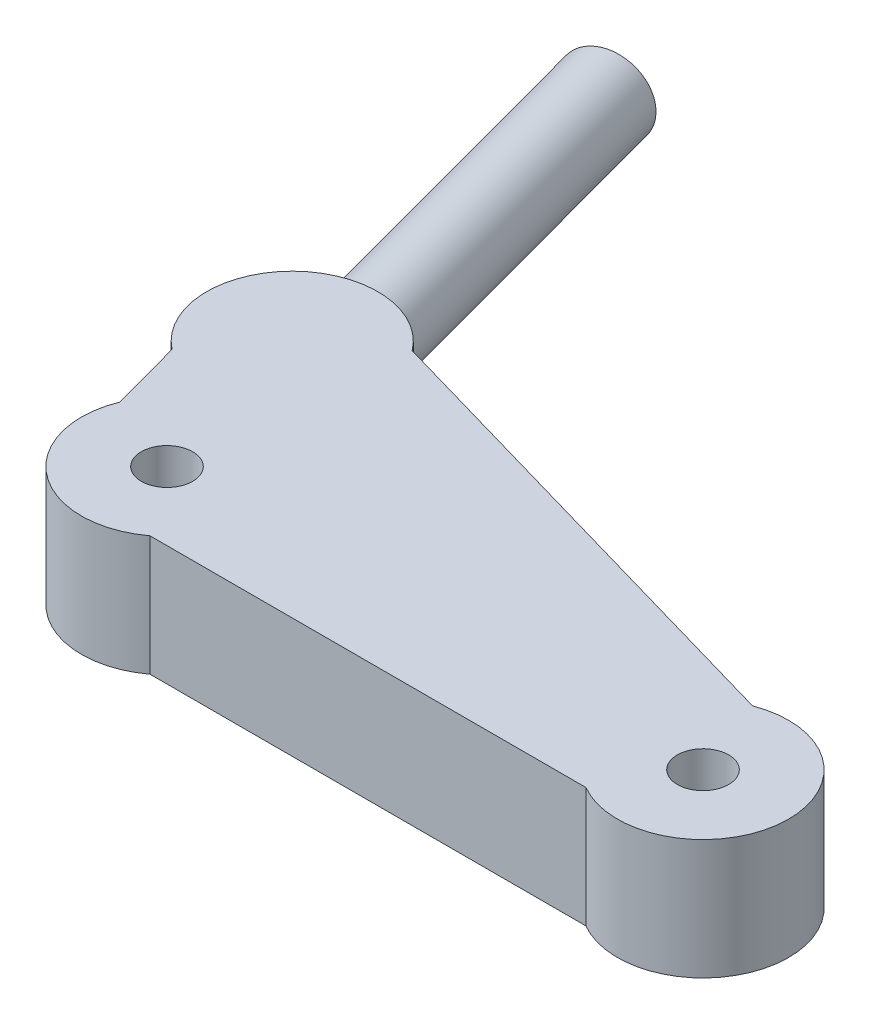
ISO-10303-21;
HEADER;
FILE_DESCRIPTION(('STEP AP214'),'2;1');
FILE_NAME('part.step','',(''),(''),'','','');
FILE_SCHEMA(('AUTOMOTIVE_DESIGN { 1 0 10303 214 1 1 1 1 }'));
ENDSEC;
DATA;
#1=APPLICATION_CONTEXT('core data for automotive mechanical design processes');
#2=APPLICATION_PROTOCOL_DEFINITION('international standard','automotive_design',2000,#1);
#3=PRODUCT_CONTEXT('',#1,'mechanical');
#4=PRODUCT('Part','Part','',(#3));
#5=PRODUCT_RELATED_PRODUCT_CATEGORY('part','',(#4));
#6=PRODUCT_DEFINITION_FORMATION('','',#4);
#7=PRODUCT_DEFINITION_CONTEXT('part definition',#1,'design');
#8=PRODUCT_DEFINITION('design','',#6,#7);
#9=PRODUCT_DEFINITION_SHAPE('','',#8);
#10=(LENGTH_UNIT() NAMED_UNIT(*) SI_UNIT(.MILLI.,.METRE.));
#11=(NAMED_UNIT(*) PLANE_ANGLE_UNIT() SI_UNIT($,.RADIAN.));
#12=(NAMED_UNIT(*) SI_UNIT($,.STERADIAN.) SOLID_ANGLE_UNIT());
#13=UNCERTAINTY_MEASURE_WITH_UNIT(LENGTH_MEASURE(1.E-05),#10,'distance_accuracy_value','');
#14=(GEOMETRIC_REPRESENTATION_CONTEXT(3) GLOBAL_UNCERTAINTY_ASSIGNED_CONTEXT((#13)) GLOBAL_UNIT_ASSIGNED_CONTEXT((#10,
#11,#12)) REPRESENTATION_CONTEXT('',''));
#15=CARTESIAN_POINT('',(0.,0.,0.));
#16=DIRECTION('',(0.,0.,1.));
#17=DIRECTION('',(1.,0.,0.));
#18=AXIS2_PLACEMENT_3D('',#15,#16,#17);
#19=CARTESIAN_POINT('',(-18.179247307751,7.,-10.));
#20=DIRECTION('',(0.,1.,0.));
#21=DIRECTION('',(0.,0.,1.));
#22=AXIS2_PLACEMENT_3D('',#19,#20,#21);
#23=PLANE('',#22);
#24=CARTESIAN_POINT('',(-15.4918422150313,7.,0.));
#25=DIRECTION('',(0.,1.,0.));
#26=DIRECTION('',(0.,0.,1.));
#27=AXIS2_PLACEMENT_3D('',#24,#25,#26);
#28=CIRCLE('',#27,1.5);
#29=CARTESIAN_POINT('',(-15.4918422150313,7.,1.5));
#30=VERTEX_POINT('',#29);
#31=EDGE_CURVE('E135',#30,#30,#28,.T.);
#32=ORIENTED_EDGE('',*,*,#31,.F.);
#33=EDGE_LOOP('',(#32));
#34=FACE_BOUND('',#33,.T.);
#35=CARTESIAN_POINT('',(-18.179247307751,7.,-10.));
#36=DIRECTION('',(0.,1.,0.));
#37=DIRECTION('',(0.,0.,1.));
#38=AXIS2_PLACEMENT_3D('',#35,#36,#37);
#39=CIRCLE('',#38,5.);
#40=CARTESIAN_POINT('',(-14.1906425698393,7.,-13.0151338684557));
#41=VERTEX_POINT('',#40);
#42=CARTESIAN_POINT('',(-21.2635894040482,7.,-6.06466852310896));
#43=VERTEX_POINT('',#42);
#44=EDGE_CURVE('E142',#41,#43,#39,.T.);
#45=ORIENTED_EDGE('',*,*,#44,.T.);
#46=DIRECTION('',(0.259531984746908,0.,0.965734512634467));
#47=VECTOR('',#46,1.);
#48=CARTESIAN_POINT('',(-21.2635894040482,7.,-6.06466852310896));
#49=LINE('',#48,#47);
#50=CARTESIAN_POINT('',(-20.1338024271363,7.,-1.86066154264863));
#51=VERTEX_POINT('',#50);
#52=EDGE_CURVE('E100',#43,#51,#49,.T.);
#53=ORIENTED_EDGE('',*,*,#52,.T.);
#54=CARTESIAN_POINT('',(-15.4918422150313,7.,0.));
#55=DIRECTION('',(0.,1.,0.));
#56=DIRECTION('',(0.,0.,1.));
#57=AXIS2_PLACEMENT_3D('',#54,#55,#56);
#58=CIRCLE('',#57,5.00098550158445);
#59=CARTESIAN_POINT('',(-12.4902,7.,4.));
#60=VERTEX_POINT('',#59);
#61=EDGE_CURVE('E113',#51,#60,#58,.T.);
#62=ORIENTED_EDGE('',*,*,#61,.T.);
#63=DIRECTION('',(1.,0.,0.));
#64=VECTOR('',#63,1.);
#65=CARTESIAN_POINT('',(12.9676692223244,7.,4.));
#66=LINE('',#65,#64);
#67=CARTESIAN_POINT('',(12.9676692223244,7.,4.));
#68=VERTEX_POINT('',#67);
#69=EDGE_CURVE('E107',#60,#68,#66,.T.);
#70=ORIENTED_EDGE('',*,*,#69,.T.);
#71=CARTESIAN_POINT('',(15.4869158310623,7.,-0.318957805346394));
#72=DIRECTION('',(0.,1.,0.));
#73=DIRECTION('',(0.,0.,-1.));
#74=AXIS2_PLACEMENT_3D('',#71,#72,#73);
#75=CIRCLE('',#74,5.);
#76=CARTESIAN_POINT('',(13.7091966439602,7.,-4.99225583690921));
#77=VERTEX_POINT('',#76);
#78=EDGE_CURVE('E111',#68,#77,#75,.T.);
#79=ORIENTED_EDGE('',*,*,#78,.T.);
#80=DIRECTION('',(-0.961053987502308,0.,-0.276360693851194));
#81=VECTOR('',#80,1.);
#82=CARTESIAN_POINT('',(-14.1906425698393,7.,-13.0151338684557));
#83=LINE('',#82,#81);
#84=EDGE_CURVE('E63',#77,#41,#83,.T.);
#85=ORIENTED_EDGE('',*,*,#84,.T.);
#86=EDGE_LOOP('',(#45,#53,#62,#70,#79,#85));
#87=FACE_BOUND('',#86,.T.);
#88=CARTESIAN_POINT('',(15.4869158310623,7.,-0.318957805346394));
#89=DIRECTION('',(0.,1.,0.));
#90=DIRECTION('',(0.,0.,-1.));
#91=AXIS2_PLACEMENT_3D('',#88,#89,#90);
#92=CIRCLE('',#91,1.49999999999981);
#93=CARTESIAN_POINT('',(15.4869158310623,7.,-1.81895780534621));
#94=VERTEX_POINT('',#93);
#95=EDGE_CURVE('E197',#94,#94,#92,.T.);
#96=ORIENTED_EDGE('',*,*,#95,.F.);
#97=EDGE_LOOP('',(#96));
#98=FACE_BOUND('',#97,.T.);
#99=ADVANCED_FACE('F40',(#34,#87,#98),#23,.T.);
#100=CARTESIAN_POINT('',(-18.179247307751,0.,-10.));
#101=DIRECTION('',(0.,1.,0.));
#102=DIRECTION('',(0.,0.,1.));
#103=AXIS2_PLACEMENT_3D('',#100,#101,#102);
#104=PLANE('',#103);
#105=CARTESIAN_POINT('',(-18.179247307751,0.,-10.));
#106=DIRECTION('',(0.,1.,0.));
#107=DIRECTION('',(0.,0.,1.));
#108=AXIS2_PLACEMENT_3D('',#105,#106,#107);
#109=CIRCLE('',#108,5.);
#110=CARTESIAN_POINT('',(-14.1906425698393,0.,-13.0151338684557));
#111=VERTEX_POINT('',#110);
#112=CARTESIAN_POINT('',(-21.2635894040482,0.,-6.06466852310896));
#113=VERTEX_POINT('',#112);
#114=EDGE_CURVE('E131',#111,#113,#109,.T.);
#115=ORIENTED_EDGE('',*,*,#114,.F.);
#116=DIRECTION('',(-0.961053987502308,0.,-0.276360693851194));
#117=VECTOR('',#116,1.);
#118=CARTESIAN_POINT('',(-14.1906425698393,0.,-13.0151338684557));
#119=LINE('',#118,#117);
#120=CARTESIAN_POINT('',(13.7091966439602,0.,-4.99225583690921));
#121=VERTEX_POINT('',#120);
#122=EDGE_CURVE('E92',#121,#111,#119,.T.);
#123=ORIENTED_EDGE('',*,*,#122,.F.);
#124=CARTESIAN_POINT('',(15.4869158310623,0.,-0.318957805346394));
#125=DIRECTION('',(0.,1.,0.));
#126=DIRECTION('',(0.,0.,-1.));
#127=AXIS2_PLACEMENT_3D('',#124,#125,#126);
#128=CIRCLE('',#127,5.);
#129=CARTESIAN_POINT('',(12.9676692223244,0.,4.));
#130=VERTEX_POINT('',#129);
#131=EDGE_CURVE('E86',#130,#121,#128,.T.);
#132=ORIENTED_EDGE('',*,*,#131,.F.);
#133=DIRECTION('',(1.,0.,0.));
#134=VECTOR('',#133,1.);
#135=CARTESIAN_POINT('',(12.9676692223244,0.,4.));
#136=LINE('',#135,#134);
#137=CARTESIAN_POINT('',(-12.4902,0.,4.));
#138=VERTEX_POINT('',#137);
#139=EDGE_CURVE('E121',#138,#130,#136,.T.);
#140=ORIENTED_EDGE('',*,*,#139,.F.);
#141=CARTESIAN_POINT('',(-15.4918422150313,0.,0.));
#142=DIRECTION('',(0.,1.,0.));
#143=DIRECTION('',(0.,0.,1.));
#144=AXIS2_PLACEMENT_3D('',#141,#142,#143);
#145=CIRCLE('',#144,5.00098550158445);
#146=CARTESIAN_POINT('',(-20.1338024271363,0.,-1.86066154264863));
#147=VERTEX_POINT('',#146);
#148=EDGE_CURVE('E137',#147,#138,#145,.T.);
#149=ORIENTED_EDGE('',*,*,#148,.F.);
#150=DIRECTION('',(0.259531984746908,0.,0.965734512634467));
#151=VECTOR('',#150,1.);
#152=CARTESIAN_POINT('',(-21.2635894040482,0.,-6.06466852310896));
#153=LINE('',#152,#151);
#154=EDGE_CURVE('E134',#113,#147,#153,.T.);
#155=ORIENTED_EDGE('',*,*,#154,.F.);
#156=EDGE_LOOP('',(#115,#123,#132,#140,#149,#155));
#157=FACE_BOUND('',#156,.T.);
#158=CARTESIAN_POINT('',(-15.4918422150313,0.,0.));
#159=DIRECTION('',(0.,1.,0.));
#160=DIRECTION('',(0.,0.,1.));
#161=AXIS2_PLACEMENT_3D('',#158,#159,#160);
#162=CIRCLE('',#161,1.5);
#163=CARTESIAN_POINT('',(-15.4918422150313,0.,1.5));
#164=VERTEX_POINT('',#163);
#165=EDGE_CURVE('E200',#164,#164,#162,.T.);
#166=ORIENTED_EDGE('',*,*,#165,.T.);
#167=EDGE_LOOP('',(#166));
#168=FACE_BOUND('',#167,.T.);
#169=CARTESIAN_POINT('',(15.4869158310623,0.,-0.318957805346394));
#170=DIRECTION('',(0.,1.,0.));
#171=DIRECTION('',(0.,0.,-1.));
#172=AXIS2_PLACEMENT_3D('',#169,#170,#171);
#173=CIRCLE('',#172,1.49999999999981);
#174=CARTESIAN_POINT('',(15.4869158310623,0.,-1.81895780534621));
#175=VERTEX_POINT('',#174);
#176=EDGE_CURVE('E195',#175,#175,#173,.T.);
#177=ORIENTED_EDGE('',*,*,#176,.T.);
#178=EDGE_LOOP('',(#177));
#179=FACE_BOUND('',#178,.T.);
#180=ADVANCED_FACE('F152',(#157,#168,#179),#104,.F.);
#181=CARTESIAN_POINT('',(-18.179247307751,7.,-10.));
#182=DIRECTION('',(0.,-1.,0.));
#183=DIRECTION('',(0.,0.,-1.));
#184=AXIS2_PLACEMENT_3D('',#181,#182,#183);
#185=CYLINDRICAL_SURFACE('',#184,5.);
#186=CARTESIAN_POINT('',(-18.179247307751,5.45922911430321,-15.));
#187=CARTESIAN_POINT('',(-18.2857592462198,5.52735384471829,-14.9999965662572));
#188=CARTESIAN_POINT('',(-18.3973995030218,5.58767772477873,-14.996575047277));
#189=CARTESIAN_POINT('',(-18.628090467786,5.6908055583881,-14.9811560180315));
#190=CARTESIAN_POINT('',(-18.7471487172025,5.73359133574816,-14.9691496457486));
#191=CARTESIAN_POINT('',(-18.9895944069379,5.80001280342622,-14.9354165254828));
#192=CARTESIAN_POINT('',(-19.1129929242066,5.8235951270392,-14.9136629478314));
#193=CARTESIAN_POINT('',(-19.3598199941782,5.85028934847184,-14.860264519332));
#194=CARTESIAN_POINT('',(-19.4832484915448,5.85341268028531,-14.8286252037246));
#195=CARTESIAN_POINT('',(-19.7203254555061,5.83942043864371,-14.7581135071818));
#196=CARTESIAN_POINT('',(-19.8341585647986,5.82327313135642,-14.7196632694235));
#197=CARTESIAN_POINT('',(-20.0552652478315,5.77303947295428,-14.6362193190674));
#198=CARTESIAN_POINT('',(-20.1625377643007,5.73895023887005,-14.5912245557142));
#199=CARTESIAN_POINT('',(-20.3694716049776,5.65358229320799,-14.4962270693554));
#200=CARTESIAN_POINT('',(-20.4690170829351,5.60208780778372,-14.4461673014629));
#201=CARTESIAN_POINT('',(-20.6572886765268,5.48364629565022,-14.3440532252254));
#202=CARTESIAN_POINT('',(-20.7460110577309,5.41669395824215,-14.2919982365403));
#203=CARTESIAN_POINT('',(-20.9185904923646,5.262662081439,-14.1841623456908));
#204=CARTESIAN_POINT('',(-21.0013897266964,5.17435403980705,-14.128441672909));
#205=CARTESIAN_POINT('',(-21.1519989021113,4.98337848626047,-14.0213560796825));
#206=CARTESIAN_POINT('',(-21.2197994157191,4.88070200884871,-13.9699939112141));
#207=CARTESIAN_POINT('',(-21.3427026194238,4.65710804251423,-13.8728569586741));
#208=CARTESIAN_POINT('',(-21.3969256347208,4.53550627471117,-13.8275316003498));
#209=CARTESIAN_POINT('',(-21.4864416984832,4.28151614156045,-13.7504652302965));
#210=CARTESIAN_POINT('',(-21.5217515332746,4.14913746185893,-13.7187121775902));
#211=CARTESIAN_POINT('',(-21.5704848603537,3.88742395450136,-13.6743065306045));
#212=CARTESIAN_POINT('',(-21.5853024309312,3.75855746844197,-13.6604421803189));
#213=CARTESIAN_POINT('',(-21.5970856771072,3.49933218542232,-13.6494468464155));
#214=CARTESIAN_POINT('',(-21.5940618159821,3.36897430786771,-13.6523060551));
#215=CARTESIAN_POINT('',(-21.5714355435637,3.12342762528895,-13.6733149115628));
#216=CARTESIAN_POINT('',(-21.553409255002,3.00795991458404,-13.6900102831125));
#217=CARTESIAN_POINT('',(-21.5033681099504,2.78249648095534,-13.7351502012677));
#218=CARTESIAN_POINT('',(-21.4713493377703,2.6725022993614,-13.763598036589));
#219=CARTESIAN_POINT('',(-21.3924109469837,2.4558438378661,-13.8312371778137));
#220=CARTESIAN_POINT('',(-21.3449205697541,2.34951489083401,-13.8708304880321));
#221=CARTESIAN_POINT('',(-21.2363110135014,2.147218762764,-13.9571669970426));
#222=CARTESIAN_POINT('',(-21.1751851968555,2.05125666210789,-14.0039136745447));
#223=CARTESIAN_POINT('',(-21.0326002018923,1.8614490123468,-14.1069356934473));
#224=CARTESIAN_POINT('',(-20.9496489731723,1.76898072553004,-14.1636940736332));
#225=CARTESIAN_POINT('',(-20.768833141092,1.60087587688351,-14.2784936768521));
#226=CARTESIAN_POINT('',(-20.670964798869,1.52524354658629,-14.3365352183731));
#227=CARTESIAN_POINT('',(-20.4597118425125,1.39177546990641,-14.4513133966997));
#228=CARTESIAN_POINT('',(-20.34606182278,1.3343156096202,-14.5080025014808));
#229=CARTESIAN_POINT('',(-20.1073317548919,1.24166488125055,-14.615144026578));
#230=CARTESIAN_POINT('',(-19.9822605268737,1.20645699255974,-14.6656011898988));
#231=CARTESIAN_POINT('',(-19.7352084804552,1.16200180916127,-14.7533911902674));
#232=CARTESIAN_POINT('',(-19.6138350735482,1.15083971734331,-14.7914663635501));
#233=CARTESIAN_POINT('',(-19.3684102191146,1.14925255677169,-14.8581933400277));
#234=CARTESIAN_POINT('',(-19.2443595770377,1.15882133489098,-14.8868479364354));
#235=CARTESIAN_POINT('',(-19.0045687027692,1.19709504742775,-14.9328418192548));
#236=CARTESIAN_POINT('',(-18.8887529043186,1.22469548488817,-14.9507260506048));
#237=CARTESIAN_POINT('',(-18.661498943189,1.29682235923034,-14.9780057266121));
#238=CARTESIAN_POINT('',(-18.5500614353375,1.34135131742887,-14.9873999060655));
#239=CARTESIAN_POINT('',(-18.3297180816254,1.44809741617934,-14.9990050487433));
#240=CARTESIAN_POINT('',(-18.2211227447861,1.51098775806633,-15.0008926748014));
#241=CARTESIAN_POINT('',(-18.0142438258868,1.65182190034257,-14.998349271588));
#242=CARTESIAN_POINT('',(-17.9159654568625,1.72977325490777,-14.9939150643151));
#243=CARTESIAN_POINT('',(-17.7238058961461,1.90660273423148,-14.9802267099878));
#244=CARTESIAN_POINT('',(-17.631094971472,2.00672603546298,-14.9705786278305));
#245=CARTESIAN_POINT('',(-17.4634366162961,2.22076996609333,-14.9492196317082));
#246=CARTESIAN_POINT('',(-17.3884952933784,2.33469531912132,-14.9375080108889));
#247=CARTESIAN_POINT('',(-17.2582262658545,2.57609560078986,-14.9148944910356));
#248=CARTESIAN_POINT('',(-17.2032727937051,2.70377619709981,-14.9040107909699));
#249=CARTESIAN_POINT('',(-17.1180874601541,2.9673608267506,-14.8862947958406));
#250=CARTESIAN_POINT('',(-17.0878260299477,3.10325481434917,-14.8794576577093));
#251=CARTESIAN_POINT('',(-17.0558375103505,3.36463486296141,-14.8721846740495));
#252=CARTESIAN_POINT('',(-17.0515468141367,3.48979318670282,-14.8711742075675));
#253=CARTESIAN_POINT('',(-17.0649393459413,3.7388421693363,-14.8742553922782));
#254=CARTESIAN_POINT('',(-17.0826182288349,3.86273307401194,-14.8783460345787));
#255=CARTESIAN_POINT('',(-17.1371446143448,4.09824124302734,-14.8902686389782));
#256=CARTESIAN_POINT('',(-17.1728015549243,4.2101515995214,-14.8978660065811));
#257=CARTESIAN_POINT('',(-17.2608902937879,4.4270269803222,-14.9151424157659));
#258=CARTESIAN_POINT('',(-17.3133339532369,4.53198703020104,-14.9248229276668));
#259=CARTESIAN_POINT('',(-17.4379541728085,4.74121184294582,-14.94517761176));
#260=CARTESIAN_POINT('',(-17.5113916158007,4.84472118310463,-14.9558684147913));
#261=CARTESIAN_POINT('',(-17.6731930937402,5.03937828964462,-14.9749893325396));
#262=CARTESIAN_POINT('',(-17.7615387643388,5.13054101883483,-14.9834221959818));
#263=CARTESIAN_POINT('',(-17.9066433430454,5.25958752208665,-14.9928202004093));
#264=CARTESIAN_POINT('',(-17.9589169820141,5.30249032127274,-14.995433898322));
#265=CARTESIAN_POINT('',(-18.0667196496275,5.38408352912749,-14.9990248447148));
#266=CARTESIAN_POINT('',(-18.122249185501,5.42277327875772,-15.0000018375113));
#267=CARTESIAN_POINT('',(-18.179247307751,5.45922911430321,-15.));
#268=B_SPLINE_CURVE_WITH_KNOTS('',3,(#186,#187,#188,#189,#190,#191,#192,#193,#194,#195,#196,
#197,#198,#199,#200,#201,#202,#203,#204,#205,#206,#207,#208,#209,#210,#211,#212,#213,#214,#215,
#216,#217,#218,#219,#220,#221,#222,#223,#224,#225,#226,#227,#228,#229,#230,#231,#232,#233,#234,
#235,#236,#237,#238,#239,#240,#241,#242,#243,#244,#245,#246,#247,#248,#249,#250,#251,#252,#253,
#254,#255,#256,#257,#258,#259,#260,#261,#262,#263,#264,#265,#266,#267),.UNSPECIFIED.,.T.,.F.,(4,
2,2,2,2,2,2,2,2,2,2,2,2,2,2,2,2,2,2,2,2,2,2,2,2,2,2,2,2,2,2,2,2,2,2,2,2,2,2,2,4),(0.,
0.379077519670047,0.758546921476519,1.13906731011105,1.51937501772497,1.88135175681389,
2.24338667731292,2.61008524213951,2.97690997787125,3.37497448241989,3.77328848473326,
4.1930375053512,4.61241335930444,5.0015615030488,5.39048144987935,5.74304661604909,
6.09571050814485,6.46322684914769,6.83092248609558,7.23879950042228,7.64677891469191,
8.06271576653227,8.4783340806089,8.85940203475011,9.24035689965225,9.59992429440969,
9.95954526376612,10.3344988774759,10.7096410477832,11.1181786725707,11.5268565128058,
11.9428338614302,12.3583123416551,12.7320064823547,13.1056267259049,13.4572372459132,
13.8090967574518,14.1896641456719,14.5697661180104,14.7725915720885,14.9754487082838),.UNSPECIFIED.);
#269=CARTESIAN_POINT('',(-18.179247307751,5.45922911430321,-15.));
#270=VERTEX_POINT('',#269);
#271=EDGE_CURVE('E45',#270,#270,#268,.T.);
#272=ORIENTED_EDGE('',*,*,#271,.T.);
#273=EDGE_LOOP('',(#272));
#274=FACE_BOUND('',#273,.T.);
#275=ORIENTED_EDGE('',*,*,#114,.T.);
#276=DIRECTION('',(0.,-1.,0.));
#277=VECTOR('',#276,1.);
#278=CARTESIAN_POINT('',(-21.2635894040482,7.,-6.06466852310896));
#279=LINE('',#278,#277);
#280=EDGE_CURVE('E11',#43,#113,#279,.T.);
#281=ORIENTED_EDGE('',*,*,#280,.F.);
#282=ORIENTED_EDGE('',*,*,#44,.F.);
#283=DIRECTION('',(0.,-1.,0.));
#284=VECTOR('',#283,1.);
#285=CARTESIAN_POINT('',(-14.1906425698393,7.,-13.0151338684557));
#286=LINE('',#285,#284);
#287=EDGE_CURVE('E127',#41,#111,#286,.T.);
#288=ORIENTED_EDGE('',*,*,#287,.T.);
#289=EDGE_LOOP('',(#275,#281,#282,#288));
#290=FACE_BOUND('',#289,.T.);
#291=ADVANCED_FACE('F42',(#274,#290),#185,.T.);
#292=CARTESIAN_POINT('',(-21.2635894040482,7.,-6.06466852310896));
#293=DIRECTION('',(0.965734512634467,0.,-0.259531984746907));
#294=DIRECTION('',(-0.259531984746908,0.,-0.965734512634467));
#295=AXIS2_PLACEMENT_3D('',#292,#293,#294);
#296=PLANE('',#295);
#297=ORIENTED_EDGE('',*,*,#154,.T.);
#298=DIRECTION('',(0.,-1.,0.));
#299=VECTOR('',#298,1.);
#300=CARTESIAN_POINT('',(-20.1338024271363,7.,-1.86066154264863));
#301=LINE('',#300,#299);
#302=EDGE_CURVE('E55',#51,#147,#301,.T.);
#303=ORIENTED_EDGE('',*,*,#302,.F.);
#304=ORIENTED_EDGE('',*,*,#52,.F.);
#305=ORIENTED_EDGE('',*,*,#280,.T.);
#306=EDGE_LOOP('',(#297,#303,#304,#305));
#307=FACE_BOUND('',#306,.T.);
#308=ADVANCED_FACE('F218',(#307),#296,.F.);
#309=CARTESIAN_POINT('',(-15.4918422150313,7.,0.));
#310=DIRECTION('',(0.,-1.,0.));
#311=DIRECTION('',(0.,0.,-1.));
#312=AXIS2_PLACEMENT_3D('',#309,#310,#311);
#313=CYLINDRICAL_SURFACE('',#312,5.00098550158445);
#314=ORIENTED_EDGE('',*,*,#148,.T.);
#315=DIRECTION('',(0.,-1.,0.));
#316=VECTOR('',#315,1.);
#317=CARTESIAN_POINT('',(-12.4902,7.,4.));
#318=LINE('',#317,#316);
#319=EDGE_CURVE('E122',#60,#138,#318,.T.);
#320=ORIENTED_EDGE('',*,*,#319,.F.);
#321=ORIENTED_EDGE('',*,*,#61,.F.);
#322=ORIENTED_EDGE('',*,*,#302,.T.);
#323=EDGE_LOOP('',(#314,#320,#321,#322));
#324=FACE_BOUND('',#323,.T.);
#325=ADVANCED_FACE('F149',(#324),#313,.T.);
#326=CARTESIAN_POINT('',(12.9676692223244,7.,4.));
#327=DIRECTION('',(0.,0.,-1.));
#328=DIRECTION('',(-1.,0.,0.));
#329=AXIS2_PLACEMENT_3D('',#326,#327,#328);
#330=PLANE('',#329);
#331=ORIENTED_EDGE('',*,*,#139,.T.);
#332=DIRECTION('',(0.,-1.,0.));
#333=VECTOR('',#332,1.);
#334=CARTESIAN_POINT('',(12.9676692223244,7.,4.));
#335=LINE('',#334,#333);
#336=EDGE_CURVE('E118',#68,#130,#335,.T.);
#337=ORIENTED_EDGE('',*,*,#336,.F.);
#338=ORIENTED_EDGE('',*,*,#69,.F.);
#339=ORIENTED_EDGE('',*,*,#319,.T.);
#340=EDGE_LOOP('',(#331,#337,#338,#339));
#341=FACE_BOUND('',#340,.T.);
#342=ADVANCED_FACE('F119',(#341),#330,.F.);
#343=CARTESIAN_POINT('',(15.4869158310623,7.,-0.318957805346394));
#344=DIRECTION('',(0.,-1.,0.));
#345=DIRECTION('',(0.,0.,-1.));
#346=AXIS2_PLACEMENT_3D('',#343,#344,#345);
#347=CYLINDRICAL_SURFACE('',#346,5.);
#348=ORIENTED_EDGE('',*,*,#131,.T.);
#349=DIRECTION('',(0.,-1.,0.));
#350=VECTOR('',#349,1.);
#351=CARTESIAN_POINT('',(13.7091966439602,7.,-4.99225583690921));
#352=LINE('',#351,#350);
#353=EDGE_CURVE('E123',#77,#121,#352,.T.);
#354=ORIENTED_EDGE('',*,*,#353,.F.);
#355=ORIENTED_EDGE('',*,*,#78,.F.);
#356=ORIENTED_EDGE('',*,*,#336,.T.);
#357=EDGE_LOOP('',(#348,#354,#355,#356));
#358=FACE_BOUND('',#357,.T.);
#359=ADVANCED_FACE('F125',(#358),#347,.T.);
#360=CARTESIAN_POINT('',(-14.1906425698393,7.,-13.0151338684557));
#361=DIRECTION('',(-0.276360693851194,0.,0.961053987502308));
#362=DIRECTION('',(0.961053987502308,0.,0.276360693851194));
#363=AXIS2_PLACEMENT_3D('',#360,#361,#362);
#364=PLANE('',#363);
#365=ORIENTED_EDGE('',*,*,#122,.T.);
#366=ORIENTED_EDGE('',*,*,#287,.F.);
#367=ORIENTED_EDGE('',*,*,#84,.F.);
#368=ORIENTED_EDGE('',*,*,#353,.T.);
#369=EDGE_LOOP('',(#365,#366,#367,#368));
#370=FACE_BOUND('',#369,.T.);
#371=ADVANCED_FACE('F157',(#370),#364,.F.);
#372=CARTESIAN_POINT('',(-15.4918422150313,7.,0.));
#373=DIRECTION('',(0.,-1.,0.));
#374=DIRECTION('',(0.,0.,-1.));
#375=AXIS2_PLACEMENT_3D('',#372,#373,#374);
#376=CYLINDRICAL_SURFACE('',#375,1.5);
#377=ORIENTED_EDGE('',*,*,#31,.T.);
#378=EDGE_LOOP('',(#377));
#379=FACE_BOUND('',#378,.T.);
#380=ORIENTED_EDGE('',*,*,#165,.F.);
#381=EDGE_LOOP('',(#380));
#382=FACE_BOUND('',#381,.T.);
#383=ADVANCED_FACE('F159',(#379,#382),#376,.F.);
#384=CARTESIAN_POINT('',(15.4869158310623,7.,-0.318957805346394));
#385=DIRECTION('',(0.,-1.,0.));
#386=DIRECTION('',(0.,0.,-1.));
#387=AXIS2_PLACEMENT_3D('',#384,#385,#386);
#388=CYLINDRICAL_SURFACE('',#387,1.49999999999981);
#389=ORIENTED_EDGE('',*,*,#95,.T.);
#390=EDGE_LOOP('',(#389));
#391=FACE_BOUND('',#390,.T.);
#392=ORIENTED_EDGE('',*,*,#176,.F.);
#393=EDGE_LOOP('',(#392));
#394=FACE_BOUND('',#393,.T.);
#395=ADVANCED_FACE('F165',(#391,#394),#388,.F.);
#396=CARTESIAN_POINT('',(-18.6983112772448,3.5,-11.9314690252689));
#397=DIRECTION('',(-0.259531984746909,0.,-0.965734512634466));
#398=DIRECTION('',(-0.965734512634466,0.,0.259531984746909));
#399=AXIS2_PLACEMENT_3D('',#396,#397,#398);
#400=CYLINDRICAL_SURFACE('',#399,2.35);
#401=CARTESIAN_POINT('',(-24.9270789111706,3.5,-35.1090973284961));
#402=DIRECTION('',(-0.259531984746909,0.,-0.965734512634466));
#403=DIRECTION('',(-0.965734512634466,0.,0.259531984746909));
#404=AXIS2_PLACEMENT_3D('',#401,#402,#403);
#405=CIRCLE('',#404,2.35);
#406=CARTESIAN_POINT('',(-27.1965550158616,3.5,-34.4991971643409));
#407=VERTEX_POINT('',#406);
#408=EDGE_CURVE('E192',#407,#407,#405,.T.);
#409=ORIENTED_EDGE('',*,*,#408,.F.);
#410=EDGE_LOOP('',(#409));
#411=FACE_BOUND('',#410,.T.);
#412=ORIENTED_EDGE('',*,*,#271,.F.);
#413=EDGE_LOOP('',(#412));
#414=FACE_BOUND('',#413,.T.);
#415=ADVANCED_FACE('F179',(#411,#414),#400,.T.);
#416=CARTESIAN_POINT('',(-24.9270789111706,3.5,-35.1090973284961));
#417=DIRECTION('',(-0.259531984746909,0.,-0.965734512634466));
#418=DIRECTION('',(-0.965734512634466,0.,0.259531984746909));
#419=AXIS2_PLACEMENT_3D('',#416,#417,#418);
#420=PLANE('',#419);
#421=ORIENTED_EDGE('',*,*,#408,.T.);
#422=EDGE_LOOP('',(#421));
#423=FACE_BOUND('',#422,.T.);
#424=ADVANCED_FACE('F184',(#423),#420,.T.);
#425=CLOSED_SHELL('',(#99,#180,#291,#308,#325,#342,#359,#371,#383,#395,#415,#424));
#426=MANIFOLD_SOLID_BREP('B2',#425);
#427=ADVANCED_BREP_SHAPE_REPRESENTATION('',(#18,#426),#14);
#428=SHAPE_DEFINITION_REPRESENTATION(#9,#427);
ENDSEC;
END-ISO-10303-21;
